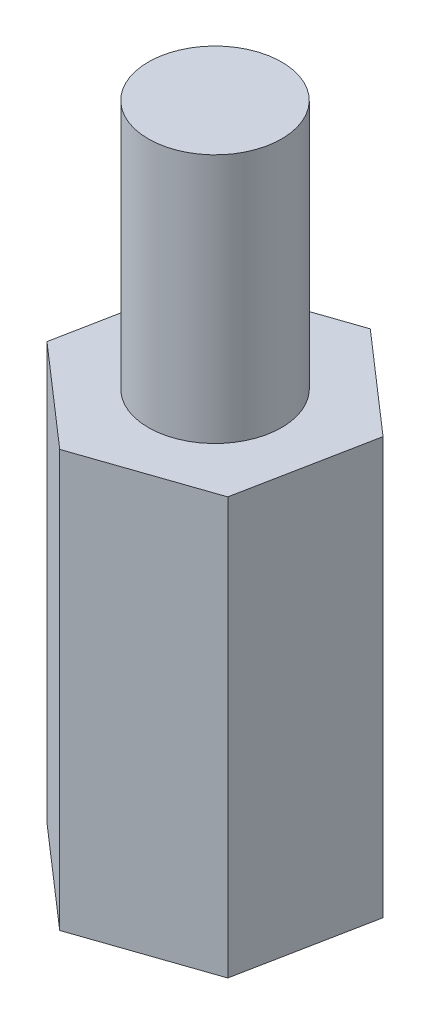
ISO-10303-21;
HEADER;
FILE_DESCRIPTION(('STEP AP214'),'2;1');
FILE_NAME('part.step','',(''),(''),'','','');
FILE_SCHEMA(('AUTOMOTIVE_DESIGN { 1 0 10303 214 1 1 1 1 }'));
ENDSEC;
DATA;
#1=APPLICATION_CONTEXT('core data for automotive mechanical design processes');
#2=APPLICATION_PROTOCOL_DEFINITION('international standard','automotive_design',2000,#1);
#3=PRODUCT_CONTEXT('',#1,'mechanical');
#4=PRODUCT('Part','Part','',(#3));
#5=PRODUCT_RELATED_PRODUCT_CATEGORY('part','',(#4));
#6=PRODUCT_DEFINITION_FORMATION('','',#4);
#7=PRODUCT_DEFINITION_CONTEXT('part definition',#1,'design');
#8=PRODUCT_DEFINITION('design','',#6,#7);
#9=PRODUCT_DEFINITION_SHAPE('','',#8);
#10=(LENGTH_UNIT() NAMED_UNIT(*) SI_UNIT(.MILLI.,.METRE.));
#11=(NAMED_UNIT(*) PLANE_ANGLE_UNIT() SI_UNIT($,.RADIAN.));
#12=(NAMED_UNIT(*) SI_UNIT($,.STERADIAN.) SOLID_ANGLE_UNIT());
#13=UNCERTAINTY_MEASURE_WITH_UNIT(LENGTH_MEASURE(1.E-05),#10,'distance_accuracy_value','');
#14=(GEOMETRIC_REPRESENTATION_CONTEXT(3) GLOBAL_UNCERTAINTY_ASSIGNED_CONTEXT((#13)) GLOBAL_UNIT_ASSIGNED_CONTEXT((#10,
#11,#12)) REPRESENTATION_CONTEXT('',''));
#15=CARTESIAN_POINT('',(0.,0.,0.));
#16=DIRECTION('',(0.,0.,1.));
#17=DIRECTION('',(1.,0.,0.));
#18=AXIS2_PLACEMENT_3D('',#15,#16,#17);
#19=CARTESIAN_POINT('',(0.,10.,0.));
#20=DIRECTION('',(0.,1.,0.));
#21=DIRECTION('',(0.,0.,1.));
#22=AXIS2_PLACEMENT_3D('',#19,#20,#21);
#23=PLANE('',#22);
#24=CARTESIAN_POINT('',(0.,10.,0.));
#25=DIRECTION('',(0.,1.,0.));
#26=DIRECTION('',(0.,0.,1.));
#27=AXIS2_PLACEMENT_3D('',#24,#25,#26);
#28=CIRCLE('',#27,1.6);
#29=CARTESIAN_POINT('',(0.,10.,1.6));
#30=VERTEX_POINT('',#29);
#31=EDGE_CURVE('E201',#30,#30,#28,.T.);
#32=ORIENTED_EDGE('',*,*,#31,.F.);
#33=EDGE_LOOP('',(#32));
#34=FACE_BOUND('',#33,.T.);
#35=DIRECTION('',(0.192332196840077,0.,-0.981329876269275));
#36=VECTOR('',#35,1.);
#37=CARTESIAN_POINT('',(2.39328878428702,10.,2.0869839789369));
#38=LINE('',#37,#36);
#39=CARTESIAN_POINT('',(2.39328878428702,10.,2.0869839789369));
#40=VERTEX_POINT('',#39);
#41=CARTESIAN_POINT('',(3.00402553519399,10.,-1.02915689631648));
#42=VERTEX_POINT('',#41);
#43=EDGE_CURVE('E145',#40,#42,#38,.T.);
#44=ORIENTED_EDGE('',*,*,#43,.T.);
#45=DIRECTION('',(-0.753690503921793,0.,-0.657229506563813));
#46=VECTOR('',#45,1.);
#47=CARTESIAN_POINT('',(3.00402553519399,10.,-1.02915689631648));
#48=LINE('',#47,#46);
#49=CARTESIAN_POINT('',(0.610736750906978,10.,-3.11614087525338));
#50=VERTEX_POINT('',#49);
#51=EDGE_CURVE('E94',#42,#50,#48,.T.);
#52=ORIENTED_EDGE('',*,*,#51,.T.);
#53=DIRECTION('',(-0.94602270076187,0.,0.324100369705462));
#54=VECTOR('',#53,1.);
#55=CARTESIAN_POINT('',(0.610736750906978,10.,-3.11614087525338));
#56=LINE('',#55,#54);
#57=CARTESIAN_POINT('',(-2.39328878428702,10.,-2.0869839789369));
#58=VERTEX_POINT('',#57);
#59=EDGE_CURVE('E106',#50,#58,#56,.T.);
#60=ORIENTED_EDGE('',*,*,#59,.T.);
#61=DIRECTION('',(-0.192332196840077,0.,0.981329876269275));
#62=VECTOR('',#61,1.);
#63=CARTESIAN_POINT('',(-2.39328878428702,10.,-2.0869839789369));
#64=LINE('',#63,#62);
#65=CARTESIAN_POINT('',(-3.00402553519399,10.,1.02915689631648));
#66=VERTEX_POINT('',#65);
#67=EDGE_CURVE('E101',#58,#66,#64,.T.);
#68=ORIENTED_EDGE('',*,*,#67,.T.);
#69=DIRECTION('',(0.753690503921793,0.,0.657229506563813));
#70=VECTOR('',#69,1.);
#71=CARTESIAN_POINT('',(-3.00402553519399,10.,1.02915689631648));
#72=LINE('',#71,#70);
#73=CARTESIAN_POINT('',(-0.610736750906977,10.,3.11614087525338));
#74=VERTEX_POINT('',#73);
#75=EDGE_CURVE('E104',#66,#74,#72,.T.);
#76=ORIENTED_EDGE('',*,*,#75,.T.);
#77=DIRECTION('',(0.94602270076187,0.,-0.324100369705462));
#78=VECTOR('',#77,1.);
#79=CARTESIAN_POINT('',(-0.610736750906977,10.,3.11614087525338));
#80=LINE('',#79,#78);
#81=EDGE_CURVE('E57',#74,#40,#80,.T.);
#82=ORIENTED_EDGE('',*,*,#81,.T.);
#83=EDGE_LOOP('',(#44,#52,#60,#68,#76,#82));
#84=FACE_BOUND('',#83,.T.);
#85=ADVANCED_FACE('F39',(#34,#84),#23,.T.);
#86=CARTESIAN_POINT('',(0.,0.,0.));
#87=DIRECTION('',(0.,1.,0.));
#88=DIRECTION('',(0.,0.,1.));
#89=AXIS2_PLACEMENT_3D('',#86,#87,#88);
#90=PLANE('',#89);
#91=DIRECTION('',(0.192332196840077,0.,-0.981329876269275));
#92=VECTOR('',#91,1.);
#93=CARTESIAN_POINT('',(2.39328878428702,0.,2.0869839789369));
#94=LINE('',#93,#92);
#95=CARTESIAN_POINT('',(2.39328878428702,0.,2.0869839789369));
#96=VERTEX_POINT('',#95);
#97=CARTESIAN_POINT('',(3.00402553519399,0.,-1.02915689631648));
#98=VERTEX_POINT('',#97);
#99=EDGE_CURVE('E128',#96,#98,#94,.T.);
#100=ORIENTED_EDGE('',*,*,#99,.F.);
#101=DIRECTION('',(0.94602270076187,0.,-0.324100369705462));
#102=VECTOR('',#101,1.);
#103=CARTESIAN_POINT('',(-0.610736750906977,0.,3.11614087525338));
#104=LINE('',#103,#102);
#105=CARTESIAN_POINT('',(-0.610736750906977,0.,3.11614087525338));
#106=VERTEX_POINT('',#105);
#107=EDGE_CURVE('E86',#106,#96,#104,.T.);
#108=ORIENTED_EDGE('',*,*,#107,.F.);
#109=DIRECTION('',(0.753690503921793,0.,0.657229506563813));
#110=VECTOR('',#109,1.);
#111=CARTESIAN_POINT('',(-3.00402553519399,0.,1.02915689631648));
#112=LINE('',#111,#110);
#113=CARTESIAN_POINT('',(-3.00402553519399,0.,1.02915689631648));
#114=VERTEX_POINT('',#113);
#115=EDGE_CURVE('E80',#114,#106,#112,.T.);
#116=ORIENTED_EDGE('',*,*,#115,.F.);
#117=DIRECTION('',(-0.192332196840077,0.,0.981329876269275));
#118=VECTOR('',#117,1.);
#119=CARTESIAN_POINT('',(-2.39328878428702,0.,-2.0869839789369));
#120=LINE('',#119,#118);
#121=CARTESIAN_POINT('',(-2.39328878428702,0.,-2.0869839789369));
#122=VERTEX_POINT('',#121);
#123=EDGE_CURVE('E115',#122,#114,#120,.T.);
#124=ORIENTED_EDGE('',*,*,#123,.F.);
#125=DIRECTION('',(-0.94602270076187,0.,0.324100369705462));
#126=VECTOR('',#125,1.);
#127=CARTESIAN_POINT('',(0.610736750906978,0.,-3.11614087525338));
#128=LINE('',#127,#126);
#129=CARTESIAN_POINT('',(0.610736750906978,0.,-3.11614087525338));
#130=VERTEX_POINT('',#129);
#131=EDGE_CURVE('E136',#130,#122,#128,.T.);
#132=ORIENTED_EDGE('',*,*,#131,.F.);
#133=DIRECTION('',(-0.753690503921793,0.,-0.657229506563813));
#134=VECTOR('',#133,1.);
#135=CARTESIAN_POINT('',(3.00402553519399,0.,-1.02915689631648));
#136=LINE('',#135,#134);
#137=EDGE_CURVE('E132',#98,#130,#136,.T.);
#138=ORIENTED_EDGE('',*,*,#137,.F.);
#139=EDGE_LOOP('',(#100,#108,#116,#124,#132,#138));
#140=FACE_BOUND('',#139,.T.);
#141=CARTESIAN_POINT('',(0.,0.,0.));
#142=DIRECTION('',(0.,1.,0.));
#143=DIRECTION('',(0.,0.,1.));
#144=AXIS2_PLACEMENT_3D('',#141,#142,#143);
#145=CIRCLE('',#144,1.5);
#146=CARTESIAN_POINT('',(0.,0.,1.5));
#147=VERTEX_POINT('',#146);
#148=EDGE_CURVE('E133',#147,#147,#145,.T.);
#149=ORIENTED_EDGE('',*,*,#148,.T.);
#150=EDGE_LOOP('',(#149));
#151=FACE_BOUND('',#150,.T.);
#152=ADVANCED_FACE('F158',(#140,#151),#90,.F.);
#153=CARTESIAN_POINT('',(2.39328878428702,10.,2.0869839789369));
#154=DIRECTION('',(-0.981329876269275,0.,-0.192332196840077));
#155=DIRECTION('',(-0.192332196840077,0.,0.981329876269275));
#156=AXIS2_PLACEMENT_3D('',#153,#154,#155);
#157=PLANE('',#156);
#158=ORIENTED_EDGE('',*,*,#99,.T.);
#159=DIRECTION('',(0.,-1.,0.));
#160=VECTOR('',#159,1.);
#161=CARTESIAN_POINT('',(3.00402553519399,10.,-1.02915689631648));
#162=LINE('',#161,#160);
#163=EDGE_CURVE('E11',#42,#98,#162,.T.);
#164=ORIENTED_EDGE('',*,*,#163,.F.);
#165=ORIENTED_EDGE('',*,*,#43,.F.);
#166=DIRECTION('',(0.,-1.,0.));
#167=VECTOR('',#166,1.);
#168=CARTESIAN_POINT('',(2.39328878428702,10.,2.0869839789369));
#169=LINE('',#168,#167);
#170=EDGE_CURVE('E124',#40,#96,#169,.T.);
#171=ORIENTED_EDGE('',*,*,#170,.T.);
#172=EDGE_LOOP('',(#158,#164,#165,#171));
#173=FACE_BOUND('',#172,.T.);
#174=ADVANCED_FACE('F41',(#173),#157,.F.);
#175=CARTESIAN_POINT('',(3.00402553519399,10.,-1.02915689631648));
#176=DIRECTION('',(-0.657229506563813,0.,0.753690503921793));
#177=DIRECTION('',(0.753690503921793,0.,0.657229506563813));
#178=AXIS2_PLACEMENT_3D('',#175,#176,#177);
#179=PLANE('',#178);
#180=ORIENTED_EDGE('',*,*,#137,.T.);
#181=DIRECTION('',(0.,-1.,0.));
#182=VECTOR('',#181,1.);
#183=CARTESIAN_POINT('',(0.610736750906978,10.,-3.11614087525338));
#184=LINE('',#183,#182);
#185=EDGE_CURVE('E49',#50,#130,#184,.T.);
#186=ORIENTED_EDGE('',*,*,#185,.F.);
#187=ORIENTED_EDGE('',*,*,#51,.F.);
#188=ORIENTED_EDGE('',*,*,#163,.T.);
#189=EDGE_LOOP('',(#180,#186,#187,#188));
#190=FACE_BOUND('',#189,.T.);
#191=ADVANCED_FACE('F255',(#190),#179,.F.);
#192=CARTESIAN_POINT('',(0.610736750906978,10.,-3.11614087525338));
#193=DIRECTION('',(0.324100369705462,0.,0.94602270076187));
#194=DIRECTION('',(0.94602270076187,0.,-0.324100369705462));
#195=AXIS2_PLACEMENT_3D('',#192,#193,#194);
#196=PLANE('',#195);
#197=ORIENTED_EDGE('',*,*,#131,.T.);
#198=DIRECTION('',(0.,-1.,0.));
#199=VECTOR('',#198,1.);
#200=CARTESIAN_POINT('',(-2.39328878428702,10.,-2.0869839789369));
#201=LINE('',#200,#199);
#202=EDGE_CURVE('E117',#58,#122,#201,.T.);
#203=ORIENTED_EDGE('',*,*,#202,.F.);
#204=ORIENTED_EDGE('',*,*,#59,.F.);
#205=ORIENTED_EDGE('',*,*,#185,.T.);
#206=EDGE_LOOP('',(#197,#203,#204,#205));
#207=FACE_BOUND('',#206,.T.);
#208=ADVANCED_FACE('F155',(#207),#196,.F.);
#209=CARTESIAN_POINT('',(-2.39328878428702,10.,-2.0869839789369));
#210=DIRECTION('',(0.981329876269275,0.,0.192332196840077));
#211=DIRECTION('',(0.192332196840077,0.,-0.981329876269275));
#212=AXIS2_PLACEMENT_3D('',#209,#210,#211);
#213=PLANE('',#212);
#214=ORIENTED_EDGE('',*,*,#123,.T.);
#215=DIRECTION('',(0.,-1.,0.));
#216=VECTOR('',#215,1.);
#217=CARTESIAN_POINT('',(-3.00402553519399,10.,1.02915689631648));
#218=LINE('',#217,#216);
#219=EDGE_CURVE('E112',#66,#114,#218,.T.);
#220=ORIENTED_EDGE('',*,*,#219,.F.);
#221=ORIENTED_EDGE('',*,*,#67,.F.);
#222=ORIENTED_EDGE('',*,*,#202,.T.);
#223=EDGE_LOOP('',(#214,#220,#221,#222));
#224=FACE_BOUND('',#223,.T.);
#225=ADVANCED_FACE('F113',(#224),#213,.F.);
#226=CARTESIAN_POINT('',(-3.00402553519399,10.,1.02915689631648));
#227=DIRECTION('',(0.657229506563813,0.,-0.753690503921793));
#228=DIRECTION('',(-0.753690503921794,0.,-0.657229506563813));
#229=AXIS2_PLACEMENT_3D('',#226,#227,#228);
#230=PLANE('',#229);
#231=ORIENTED_EDGE('',*,*,#115,.T.);
#232=DIRECTION('',(0.,-1.,0.));
#233=VECTOR('',#232,1.);
#234=CARTESIAN_POINT('',(-0.610736750906977,10.,3.11614087525338));
#235=LINE('',#234,#233);
#236=EDGE_CURVE('E118',#74,#106,#235,.T.);
#237=ORIENTED_EDGE('',*,*,#236,.F.);
#238=ORIENTED_EDGE('',*,*,#75,.F.);
#239=ORIENTED_EDGE('',*,*,#219,.T.);
#240=EDGE_LOOP('',(#231,#237,#238,#239));
#241=FACE_BOUND('',#240,.T.);
#242=ADVANCED_FACE('F120',(#241),#230,.F.);
#243=CARTESIAN_POINT('',(-0.610736750906977,10.,3.11614087525338));
#244=DIRECTION('',(-0.324100369705462,0.,-0.94602270076187));
#245=DIRECTION('',(-0.94602270076187,0.,0.324100369705462));
#246=AXIS2_PLACEMENT_3D('',#243,#244,#245);
#247=PLANE('',#246);
#248=ORIENTED_EDGE('',*,*,#107,.T.);
#249=ORIENTED_EDGE('',*,*,#170,.F.);
#250=ORIENTED_EDGE('',*,*,#81,.F.);
#251=ORIENTED_EDGE('',*,*,#236,.T.);
#252=EDGE_LOOP('',(#248,#249,#250,#251));
#253=FACE_BOUND('',#252,.T.);
#254=ADVANCED_FACE('F163',(#253),#247,.F.);
#255=CARTESIAN_POINT('',(0.,10.,0.));
#256=DIRECTION('',(0.,-1.,0.));
#257=DIRECTION('',(0.,0.,-1.));
#258=AXIS2_PLACEMENT_3D('',#255,#256,#257);
#259=CYLINDRICAL_SURFACE('',#258,1.5);
#260=CARTESIAN_POINT('',(0.,10.,0.));
#261=DIRECTION('',(0.,1.,0.));
#262=DIRECTION('',(0.,0.,1.));
#263=AXIS2_PLACEMENT_3D('',#260,#261,#262);
#264=CIRCLE('',#263,1.5);
#265=CARTESIAN_POINT('',(0.,10.,1.5));
#266=VERTEX_POINT('',#265);
#267=EDGE_CURVE('E200',#266,#266,#264,.T.);
#268=ORIENTED_EDGE('',*,*,#267,.T.);
#269=EDGE_LOOP('',(#268));
#270=FACE_BOUND('',#269,.T.);
#271=ORIENTED_EDGE('',*,*,#148,.F.);
#272=EDGE_LOOP('',(#271));
#273=FACE_BOUND('',#272,.T.);
#274=ADVANCED_FACE('F165',(#270,#273),#259,.F.);
#275=CARTESIAN_POINT('',(0.,10.,0.));
#276=DIRECTION('',(0.,1.,0.));
#277=DIRECTION('',(0.,0.,1.));
#278=AXIS2_PLACEMENT_3D('',#275,#276,#277);
#279=PLANE('',#278);
#280=ORIENTED_EDGE('',*,*,#267,.F.);
#281=EDGE_LOOP('',(#280));
#282=FACE_BOUND('',#281,.T.);
#283=ADVANCED_FACE('F171',(#282),#279,.F.);
#284=CARTESIAN_POINT('',(0.,16.,0.));
#285=DIRECTION('',(0.,-1.,0.));
#286=DIRECTION('',(0.,0.,-1.));
#287=AXIS2_PLACEMENT_3D('',#284,#285,#286);
#288=CYLINDRICAL_SURFACE('',#287,1.6);
#289=CARTESIAN_POINT('',(0.,16.,0.));
#290=DIRECTION('',(0.,1.,0.));
#291=DIRECTION('',(0.,0.,1.));
#292=AXIS2_PLACEMENT_3D('',#289,#290,#291);
#293=CIRCLE('',#292,1.6);
#294=CARTESIAN_POINT('',(0.,16.,1.6));
#295=VERTEX_POINT('',#294);
#296=EDGE_CURVE('E198',#295,#295,#293,.T.);
#297=ORIENTED_EDGE('',*,*,#296,.F.);
#298=EDGE_LOOP('',(#297));
#299=FACE_BOUND('',#298,.T.);
#300=ORIENTED_EDGE('',*,*,#31,.T.);
#301=EDGE_LOOP('',(#300));
#302=FACE_BOUND('',#301,.T.);
#303=ADVANCED_FACE('F184',(#299,#302),#288,.T.);
#304=CARTESIAN_POINT('',(0.,16.,0.));
#305=DIRECTION('',(0.,1.,0.));
#306=DIRECTION('',(0.,0.,1.));
#307=AXIS2_PLACEMENT_3D('',#304,#305,#306);
#308=PLANE('',#307);
#309=ORIENTED_EDGE('',*,*,#296,.T.);
#310=EDGE_LOOP('',(#309));
#311=FACE_BOUND('',#310,.T.);
#312=ADVANCED_FACE('F187',(#311),#308,.T.);
#313=CLOSED_SHELL('',(#85,#152,#174,#191,#208,#225,#242,#254,#274,#283,#303,#312));
#314=MANIFOLD_SOLID_BREP('B2',#313);
#315=ADVANCED_BREP_SHAPE_REPRESENTATION('',(#18,#314),#14);
#316=SHAPE_DEFINITION_REPRESENTATION(#9,#315);
ENDSEC;
END-ISO-10303-21;
